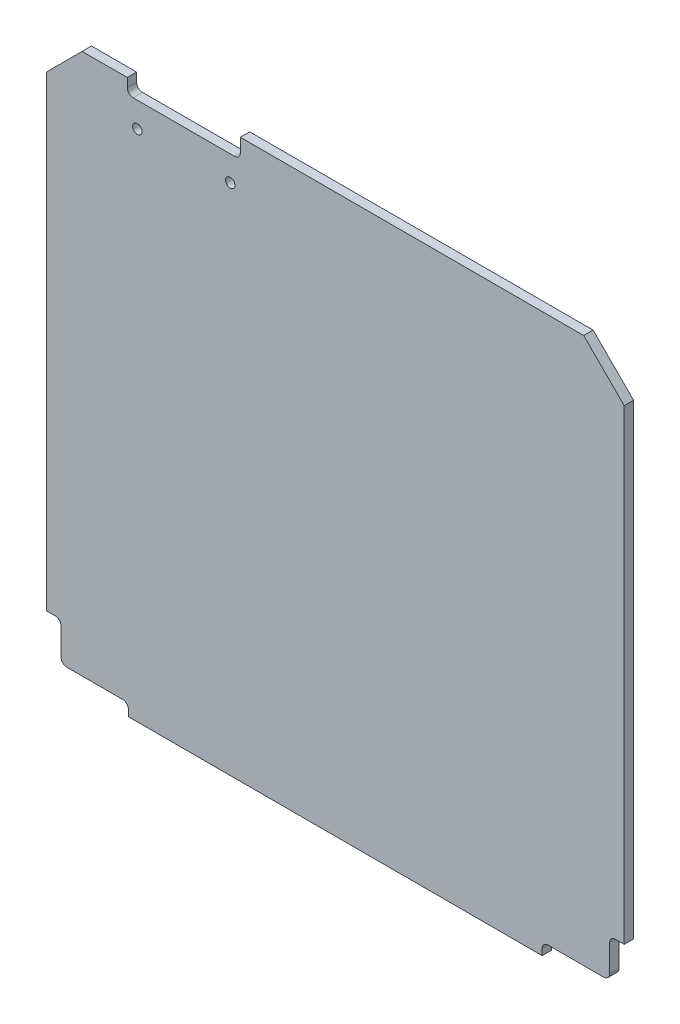
ISO-10303-21;
HEADER;
FILE_DESCRIPTION(('STEP AP214'),'2;1');
FILE_NAME('part.step','',(''),(''),'','','');
FILE_SCHEMA(('AUTOMOTIVE_DESIGN { 1 0 10303 214 1 1 1 1 }'));
ENDSEC;
DATA;
#1=APPLICATION_CONTEXT('core data for automotive mechanical design processes');
#2=APPLICATION_PROTOCOL_DEFINITION('international standard','automotive_design',2000,#1);
#3=PRODUCT_CONTEXT('',#1,'mechanical');
#4=PRODUCT('Part','Part','',(#3));
#5=PRODUCT_RELATED_PRODUCT_CATEGORY('part','',(#4));
#6=PRODUCT_DEFINITION_FORMATION('','',#4);
#7=PRODUCT_DEFINITION_CONTEXT('part definition',#1,'design');
#8=PRODUCT_DEFINITION('design','',#6,#7);
#9=PRODUCT_DEFINITION_SHAPE('','',#8);
#10=(LENGTH_UNIT() NAMED_UNIT(*) SI_UNIT(.MILLI.,.METRE.));
#11=(NAMED_UNIT(*) PLANE_ANGLE_UNIT() SI_UNIT($,.RADIAN.));
#12=(NAMED_UNIT(*) SI_UNIT($,.STERADIAN.) SOLID_ANGLE_UNIT());
#13=UNCERTAINTY_MEASURE_WITH_UNIT(LENGTH_MEASURE(1.E-05),#10,'distance_accuracy_value','');
#14=(GEOMETRIC_REPRESENTATION_CONTEXT(3) GLOBAL_UNCERTAINTY_ASSIGNED_CONTEXT((#13)) GLOBAL_UNIT_ASSIGNED_CONTEXT((#10,
#11,#12)) REPRESENTATION_CONTEXT('',''));
#15=CARTESIAN_POINT('',(0.,0.,0.));
#16=DIRECTION('',(0.,0.,1.));
#17=DIRECTION('',(1.,0.,0.));
#18=AXIS2_PLACEMENT_3D('',#15,#16,#17);
#19=CARTESIAN_POINT('',(0.,0.,1.5875));
#20=DIRECTION('',(0.,0.,1.));
#21=DIRECTION('',(1.,0.,0.));
#22=AXIS2_PLACEMENT_3D('',#19,#20,#21);
#23=PLANE('',#22);
#24=CARTESIAN_POINT('',(-36.3,-48.0000000000001,1.5875));
#25=DIRECTION('',(0.,0.,1.));
#26=DIRECTION('',(1.,0.,0.));
#27=AXIS2_PLACEMENT_3D('',#24,#25,#26);
#28=CIRCLE('',#27,1.);
#29=CARTESIAN_POINT('',(-36.3,-47.0000000000001,1.5875));
#30=VERTEX_POINT('',#29);
#31=CARTESIAN_POINT('',(-35.3,-48.0000000000001,1.5875));
#32=VERTEX_POINT('',#31);
#33=EDGE_CURVE('E344',#30,#32,#28,.F.);
#34=ORIENTED_EDGE('',*,*,#33,.T.);
#35=DIRECTION('',(0.,1.,0.));
#36=VECTOR('',#35,1.);
#37=CARTESIAN_POINT('',(-35.3,0.,1.5875));
#38=LINE('',#37,#36);
#39=CARTESIAN_POINT('',(-35.3,-49.0649999999988,1.5875));
#40=VERTEX_POINT('',#39);
#41=EDGE_CURVE('E227',#32,#40,#38,.F.);
#42=ORIENTED_EDGE('',*,*,#41,.T.);
#43=DIRECTION('',(1.,0.,0.));
#44=VECTOR('',#43,1.);
#45=CARTESIAN_POINT('',(-8.39674998261844,-49.0649999999989,1.5875));
#46=LINE('',#45,#44);
#47=CARTESIAN_POINT('',(35.3,-49.064999999999,1.5875));
#48=VERTEX_POINT('',#47);
#49=EDGE_CURVE('E225',#48,#40,#46,.F.);
#50=ORIENTED_EDGE('',*,*,#49,.F.);
#51=DIRECTION('',(0.,1.,0.));
#52=VECTOR('',#51,1.);
#53=CARTESIAN_POINT('',(35.3,0.,1.5875));
#54=LINE('',#53,#52);
#55=CARTESIAN_POINT('',(35.3,-48.0000000000001,1.5875));
#56=VERTEX_POINT('',#55);
#57=EDGE_CURVE('E185',#48,#56,#54,.T.);
#58=ORIENTED_EDGE('',*,*,#57,.T.);
#59=CARTESIAN_POINT('',(36.3,-48.0000000000001,1.5875));
#60=DIRECTION('',(0.,0.,1.));
#61=DIRECTION('',(0.,-1.,0.));
#62=AXIS2_PLACEMENT_3D('',#59,#60,#61);
#63=CIRCLE('',#62,1.);
#64=CARTESIAN_POINT('',(36.3,-47.0000000000001,1.5875));
#65=VERTEX_POINT('',#64);
#66=EDGE_CURVE('E198',#56,#65,#63,.F.);
#67=ORIENTED_EDGE('',*,*,#66,.T.);
#68=DIRECTION('',(-1.,0.,0.));
#69=VECTOR('',#68,1.);
#70=CARTESIAN_POINT('',(34.9999999999996,-47.0000000000001,1.5875));
#71=LINE('',#70,#69);
#72=CARTESIAN_POINT('',(45.7999999999989,-47.0000000000001,1.5875));
#73=VERTEX_POINT('',#72);
#74=EDGE_CURVE('E190',#65,#73,#71,.F.);
#75=ORIENTED_EDGE('',*,*,#74,.T.);
#76=CARTESIAN_POINT('',(45.7999999999989,-46.0000000000001,1.5875));
#77=DIRECTION('',(0.,0.,1.));
#78=DIRECTION('',(0.,-1.,0.));
#79=AXIS2_PLACEMENT_3D('',#76,#77,#78);
#80=CIRCLE('',#79,1.);
#81=CARTESIAN_POINT('',(46.7999999999989,-46.0000000000001,1.5875));
#82=VERTEX_POINT('',#81);
#83=EDGE_CURVE('E210',#82,#73,#80,.F.);
#84=ORIENTED_EDGE('',*,*,#83,.F.);
#85=DIRECTION('',(0.,1.,0.));
#86=VECTOR('',#85,1.);
#87=CARTESIAN_POINT('',(46.7999999999989,-45.9,1.5875));
#88=LINE('',#87,#86);
#89=CARTESIAN_POINT('',(46.7999999999989,-41.400000000001,1.5875));
#90=VERTEX_POINT('',#89);
#91=EDGE_CURVE('E302',#82,#90,#88,.T.);
#92=ORIENTED_EDGE('',*,*,#91,.T.);
#93=CARTESIAN_POINT('',(47.7999999999989,-41.400000000001,1.5875));
#94=DIRECTION('',(0.,0.,-1.));
#95=DIRECTION('',(0.,1.,0.));
#96=AXIS2_PLACEMENT_3D('',#93,#94,#95);
#97=CIRCLE('',#96,1.);
#98=CARTESIAN_POINT('',(47.7999999999989,-40.400000000001,1.5875));
#99=VERTEX_POINT('',#98);
#100=EDGE_CURVE('E304',#90,#99,#97,.T.);
#101=ORIENTED_EDGE('',*,*,#100,.T.);
#102=DIRECTION('',(1.,0.,0.));
#103=VECTOR('',#102,1.);
#104=CARTESIAN_POINT('',(47.8999999999989,-40.400000000001,1.5875));
#105=LINE('',#104,#103);
#106=CARTESIAN_POINT('',(49.3,-40.400000000001,1.5875));
#107=VERTEX_POINT('',#106);
#108=EDGE_CURVE('E294',#99,#107,#105,.T.);
#109=ORIENTED_EDGE('',*,*,#108,.T.);
#110=DIRECTION('',(0.,1.,0.));
#111=VECTOR('',#110,1.);
#112=CARTESIAN_POINT('',(49.3,50.,1.5875));
#113=LINE('',#112,#111);
#114=CARTESIAN_POINT('',(49.3,39.200000000002,1.5875));
#115=VERTEX_POINT('',#114);
#116=EDGE_CURVE('E292',#115,#107,#113,.F.);
#117=ORIENTED_EDGE('',*,*,#116,.F.);
#118=DIRECTION('',(-0.707106781186546,0.707106781186549,0.));
#119=VECTOR('',#118,1.);
#120=CARTESIAN_POINT('',(40.500000000001,48.0000000000009,1.5875));
#121=LINE('',#120,#119);
#122=CARTESIAN_POINT('',(42.3850000000029,46.1149999999991,1.5875));
#123=VERTEX_POINT('',#122);
#124=EDGE_CURVE('E286',#123,#115,#121,.F.);
#125=ORIENTED_EDGE('',*,*,#124,.F.);
#126=DIRECTION('',(1.,0.,0.));
#127=VECTOR('',#126,1.);
#128=CARTESIAN_POINT('',(8.7249999826205,46.1149999999992,1.5875));
#129=LINE('',#128,#127);
#130=CARTESIAN_POINT('',(-16.2000000086743,46.1149999999993,1.5875));
#131=VERTEX_POINT('',#130);
#132=EDGE_CURVE('E278',#123,#131,#129,.F.);
#133=ORIENTED_EDGE('',*,*,#132,.T.);
#134=DIRECTION('',(0.,-1.,0.));
#135=VECTOR('',#134,1.);
#136=CARTESIAN_POINT('',(-16.2000000086743,43.5490937294837,1.5875));
#137=LINE('',#136,#135);
#138=CARTESIAN_POINT('',(-16.2000000086743,43.8000000000008,1.5875));
#139=VERTEX_POINT('',#138);
#140=EDGE_CURVE('E275',#139,#131,#137,.F.);
#141=ORIENTED_EDGE('',*,*,#140,.F.);
#142=CARTESIAN_POINT('',(-17.2000000086743,43.8000000000008,1.5875));
#143=DIRECTION('',(0.,0.,-1.));
#144=DIRECTION('',(0.,1.,0.));
#145=AXIS2_PLACEMENT_3D('',#142,#143,#144);
#146=CIRCLE('',#145,1.);
#147=CARTESIAN_POINT('',(-17.2000000086743,42.8000000000008,1.58750000000001));
#148=VERTEX_POINT('',#147);
#149=EDGE_CURVE('E274',#139,#148,#146,.T.);
#150=ORIENTED_EDGE('',*,*,#149,.T.);
#151=DIRECTION('',(1.,0.,0.));
#152=VECTOR('',#151,1.);
#153=CARTESIAN_POINT('',(-36.5,42.8000000000009,1.58750000000002));
#154=LINE('',#153,#152);
#155=CARTESIAN_POINT('',(-34.5000000173737,42.8000000000008,1.5875));
#156=VERTEX_POINT('',#155);
#157=EDGE_CURVE('E271',#148,#156,#154,.F.);
#158=ORIENTED_EDGE('',*,*,#157,.T.);
#159=CARTESIAN_POINT('',(-34.5000000173737,43.8000000000008,1.58749999999999));
#160=DIRECTION('',(0.,0.,1.));
#161=DIRECTION('',(0.,-1.,0.));
#162=AXIS2_PLACEMENT_3D('',#159,#160,#161);
#163=CIRCLE('',#162,1.);
#164=CARTESIAN_POINT('',(-35.5000000173737,43.8000000000008,1.5875));
#165=VERTEX_POINT('',#164);
#166=EDGE_CURVE('E268',#156,#165,#163,.F.);
#167=ORIENTED_EDGE('',*,*,#166,.T.);
#168=DIRECTION('',(0.,-1.,0.));
#169=VECTOR('',#168,1.);
#170=CARTESIAN_POINT('',(-35.5000000173737,42.723625569532,1.5875));
#171=LINE('',#170,#169);
#172=CARTESIAN_POINT('',(-35.5000000173737,45.3000000000009,1.58749999999999));
#173=VERTEX_POINT('',#172);
#174=EDGE_CURVE('E265',#165,#173,#171,.F.);
#175=ORIENTED_EDGE('',*,*,#174,.T.);
#176=DIRECTION('',(1.,0.,0.));
#177=VECTOR('',#176,1.);
#178=CARTESIAN_POINT('',(-36.5,45.3000000000009,1.58749999999999));
#179=LINE('',#178,#177);
#180=CARTESIAN_POINT('',(-43.2000000000015,45.3000000000009,1.5875));
#181=VERTEX_POINT('',#180);
#182=EDGE_CURVE('E260',#173,#181,#179,.F.);
#183=ORIENTED_EDGE('',*,*,#182,.T.);
#184=DIRECTION('',(0.707106781186551,0.707106781186544,0.));
#185=VECTOR('',#184,1.);
#186=CARTESIAN_POINT('',(-40.500000000001,48.0000000000013,1.5875));
#187=LINE('',#186,#185);
#188=CARTESIAN_POINT('',(-49.3,39.2000000000024,1.58749999999999));
#189=VERTEX_POINT('',#188);
#190=EDGE_CURVE('E255',#181,#189,#187,.F.);
#191=ORIENTED_EDGE('',*,*,#190,.T.);
#192=DIRECTION('',(0.,1.,0.));
#193=VECTOR('',#192,1.);
#194=CARTESIAN_POINT('',(-49.3000000000007,-214.000093457924,1.58749999999999));
#195=LINE('',#194,#193);
#196=CARTESIAN_POINT('',(-49.3000000000003,-40.400000000001,1.5875));
#197=VERTEX_POINT('',#196);
#198=EDGE_CURVE('E250',#189,#197,#195,.F.);
#199=ORIENTED_EDGE('',*,*,#198,.T.);
#200=DIRECTION('',(1.,0.,0.));
#201=VECTOR('',#200,1.);
#202=CARTESIAN_POINT('',(-51.8999999999992,-40.400000000001,1.5875));
#203=LINE('',#202,#201);
#204=CARTESIAN_POINT('',(-47.7999999999992,-40.400000000001,1.5875));
#205=VERTEX_POINT('',#204);
#206=EDGE_CURVE('E244',#197,#205,#203,.T.);
#207=ORIENTED_EDGE('',*,*,#206,.T.);
#208=CARTESIAN_POINT('',(-47.7999999999992,-41.400000000001,1.5875));
#209=DIRECTION('',(0.,0.,1.));
#210=DIRECTION('',(0.,-1.,0.));
#211=AXIS2_PLACEMENT_3D('',#208,#209,#210);
#212=CIRCLE('',#211,1.);
#213=CARTESIAN_POINT('',(-46.7999999999992,-41.400000000001,1.5875));
#214=VERTEX_POINT('',#213);
#215=EDGE_CURVE('E243',#205,#214,#212,.F.);
#216=ORIENTED_EDGE('',*,*,#215,.T.);
#217=DIRECTION('',(0.,1.,0.));
#218=VECTOR('',#217,1.);
#219=CARTESIAN_POINT('',(-46.7999999999992,-41.400000000001,1.5875));
#220=LINE('',#219,#218);
#221=CARTESIAN_POINT('',(-46.7999999999992,-46.0000000000001,1.5875));
#222=VERTEX_POINT('',#221);
#223=EDGE_CURVE('E239',#214,#222,#220,.F.);
#224=ORIENTED_EDGE('',*,*,#223,.T.);
#225=CARTESIAN_POINT('',(-45.7999999999992,-46.0000000000001,1.5875));
#226=DIRECTION('',(0.,0.,-1.));
#227=DIRECTION('',(-1.,0.,0.));
#228=AXIS2_PLACEMENT_3D('',#225,#226,#227);
#229=CIRCLE('',#228,1.);
#230=CARTESIAN_POINT('',(-45.7999999999992,-47.,1.5875));
#231=VERTEX_POINT('',#230);
#232=EDGE_CURVE('E347',#231,#222,#229,.T.);
#233=ORIENTED_EDGE('',*,*,#232,.F.);
#234=DIRECTION('',(-1.,0.,0.));
#235=VECTOR('',#234,1.);
#236=CARTESIAN_POINT('',(0.,-47.0000000000001,1.5875));
#237=LINE('',#236,#235);
#238=EDGE_CURVE('E235',#231,#30,#237,.F.);
#239=ORIENTED_EDGE('',*,*,#238,.T.);
#240=EDGE_LOOP('',(#34,#42,#50,#58,#67,#75,#84,#92,#101,#109,#117,#125,#133,#141,#150,#158,#167,
#175,#183,#191,#199,#207,#216,#224,#233,#239));
#241=FACE_BOUND('',#240,.T.);
#242=CARTESIAN_POINT('',(-17.9250000173796,38.5406079999998,1.5875));
#243=DIRECTION('',(0.,0.,1.));
#244=DIRECTION('',(1.,0.,0.));
#245=AXIS2_PLACEMENT_3D('',#242,#243,#244);
#246=CIRCLE('',#245,0.8);
#247=CARTESIAN_POINT('',(-17.1250000173796,38.5406079999998,1.5875));
#248=VERTEX_POINT('',#247);
#249=EDGE_CURVE('E222',#248,#248,#246,.F.);
#250=ORIENTED_EDGE('',*,*,#249,.T.);
#251=EDGE_LOOP('',(#250));
#252=FACE_BOUND('',#251,.T.);
#253=CARTESIAN_POINT('',(-33.775,38.5399999996693,1.5875));
#254=DIRECTION('',(0.,0.,1.));
#255=DIRECTION('',(0.,-1.,0.));
#256=AXIS2_PLACEMENT_3D('',#253,#254,#255);
#257=CIRCLE('',#256,0.799999999999997);
#258=CARTESIAN_POINT('',(-33.775,37.7399999996693,1.5875));
#259=VERTEX_POINT('',#258);
#260=EDGE_CURVE('E20',#259,#259,#257,.F.);
#261=ORIENTED_EDGE('',*,*,#260,.T.);
#262=EDGE_LOOP('',(#261));
#263=FACE_BOUND('',#262,.T.);
#264=ADVANCED_FACE('F17',(#241,#252,#263),#23,.T.);
#265=CARTESIAN_POINT('',(-33.775,38.5399999996693,-0.232500000000009));
#266=DIRECTION('',(0.,0.,1.));
#267=DIRECTION('',(0.,-1.,0.));
#268=AXIS2_PLACEMENT_3D('',#265,#266,#267);
#269=CYLINDRICAL_SURFACE('',#268,0.799999999999997);
#270=ORIENTED_EDGE('',*,*,#260,.F.);
#271=EDGE_LOOP('',(#270));
#272=FACE_BOUND('',#271,.T.);
#273=CARTESIAN_POINT('',(-33.775,38.5399999996693,-0.0125000000000028));
#274=DIRECTION('',(0.,0.,1.));
#275=DIRECTION('',(0.,-1.,0.));
#276=AXIS2_PLACEMENT_3D('',#273,#274,#275);
#277=CIRCLE('',#276,0.799999999999997);
#278=CARTESIAN_POINT('',(-33.775,37.7399999996693,-0.0125000000000028));
#279=VERTEX_POINT('',#278);
#280=EDGE_CURVE('E218',#279,#279,#277,.F.);
#281=ORIENTED_EDGE('',*,*,#280,.T.);
#282=EDGE_LOOP('',(#281));
#283=FACE_BOUND('',#282,.T.);
#284=ADVANCED_FACE('F365',(#272,#283),#269,.F.);
#285=CARTESIAN_POINT('',(-17.9250000173796,38.5406079999998,-0.232500000000016));
#286=DIRECTION('',(0.,0.,1.));
#287=DIRECTION('',(1.,0.,0.));
#288=AXIS2_PLACEMENT_3D('',#285,#286,#287);
#289=CYLINDRICAL_SURFACE('',#288,0.8);
#290=ORIENTED_EDGE('',*,*,#249,.F.);
#291=EDGE_LOOP('',(#290));
#292=FACE_BOUND('',#291,.T.);
#293=CARTESIAN_POINT('',(-17.9250000173796,38.5406079999998,-0.0125000000000028));
#294=DIRECTION('',(0.,0.,1.));
#295=DIRECTION('',(1.,0.,0.));
#296=AXIS2_PLACEMENT_3D('',#293,#294,#295);
#297=CIRCLE('',#296,0.8);
#298=CARTESIAN_POINT('',(-17.1250000173796,38.5406079999998,-0.0125000000000028));
#299=VERTEX_POINT('',#298);
#300=EDGE_CURVE('E339',#299,#299,#297,.F.);
#301=ORIENTED_EDGE('',*,*,#300,.T.);
#302=EDGE_LOOP('',(#301));
#303=FACE_BOUND('',#302,.T.);
#304=ADVANCED_FACE('F368',(#292,#303),#289,.F.);
#305=CARTESIAN_POINT('',(35.3,0.,1.5875));
#306=DIRECTION('',(-1.,0.,0.));
#307=DIRECTION('',(0.,0.,1.));
#308=AXIS2_PLACEMENT_3D('',#305,#306,#307);
#309=PLANE('',#308);
#310=DIRECTION('',(0.,0.,1.));
#311=VECTOR('',#310,1.);
#312=CARTESIAN_POINT('',(35.3,-48.0000000000001,0.));
#313=LINE('',#312,#311);
#314=CARTESIAN_POINT('',(35.3,-48.0000000000001,-0.0125000000000028));
#315=VERTEX_POINT('',#314);
#316=EDGE_CURVE('E203',#315,#56,#313,.T.);
#317=ORIENTED_EDGE('',*,*,#316,.T.);
#318=ORIENTED_EDGE('',*,*,#57,.F.);
#319=DIRECTION('',(0.,0.,1.));
#320=VECTOR('',#319,1.);
#321=CARTESIAN_POINT('',(35.3,-49.064999999999,6.49125000000005));
#322=LINE('',#321,#320);
#323=CARTESIAN_POINT('',(35.3,-49.0649999999989,-0.0125000000000029));
#324=VERTEX_POINT('',#323);
#325=EDGE_CURVE('E215',#324,#48,#322,.T.);
#326=ORIENTED_EDGE('',*,*,#325,.F.);
#327=DIRECTION('',(0.,1.,0.));
#328=VECTOR('',#327,1.);
#329=CARTESIAN_POINT('',(35.3,0.,-0.0125000000000028));
#330=LINE('',#329,#328);
#331=EDGE_CURVE('E338',#324,#315,#330,.T.);
#332=ORIENTED_EDGE('',*,*,#331,.T.);
#333=EDGE_LOOP('',(#317,#318,#326,#332));
#334=FACE_BOUND('',#333,.T.);
#335=ADVANCED_FACE('F476',(#334),#309,.F.);
#336=CARTESIAN_POINT('',(36.3,-48.0000000000001,0.));
#337=DIRECTION('',(0.,0.,1.));
#338=DIRECTION('',(0.,-1.,0.));
#339=AXIS2_PLACEMENT_3D('',#336,#337,#338);
#340=CYLINDRICAL_SURFACE('',#339,1.);
#341=ORIENTED_EDGE('',*,*,#66,.F.);
#342=ORIENTED_EDGE('',*,*,#316,.F.);
#343=CARTESIAN_POINT('',(36.3,-48.0000000000001,-0.0125000000000028));
#344=DIRECTION('',(0.,0.,1.));
#345=DIRECTION('',(0.,-1.,0.));
#346=AXIS2_PLACEMENT_3D('',#343,#344,#345);
#347=CIRCLE('',#346,1.);
#348=CARTESIAN_POINT('',(36.3,-47.0000000000001,-0.0125000000000028));
#349=VERTEX_POINT('',#348);
#350=EDGE_CURVE('E208',#315,#349,#347,.F.);
#351=ORIENTED_EDGE('',*,*,#350,.T.);
#352=DIRECTION('',(0.,0.,1.));
#353=VECTOR('',#352,1.);
#354=CARTESIAN_POINT('',(36.3,-47.0000000000001,-0.232500000000009));
#355=LINE('',#354,#353);
#356=EDGE_CURVE('E194',#349,#65,#355,.T.);
#357=ORIENTED_EDGE('',*,*,#356,.T.);
#358=EDGE_LOOP('',(#341,#342,#351,#357));
#359=FACE_BOUND('',#358,.T.);
#360=ADVANCED_FACE('F206',(#359),#340,.F.);
#361=CARTESIAN_POINT('',(34.9999999999996,-47.0000000000001,-0.232500000000009));
#362=DIRECTION('',(0.,1.,0.));
#363=DIRECTION('',(-1.,0.,0.));
#364=AXIS2_PLACEMENT_3D('',#361,#362,#363);
#365=PLANE('',#364);
#366=DIRECTION('',(1.,0.,0.));
#367=VECTOR('',#366,1.);
#368=CARTESIAN_POINT('',(0.,-47.0000000000001,-0.0125000000000028));
#369=LINE('',#368,#367);
#370=CARTESIAN_POINT('',(45.7999999999989,-47.0000000000001,-0.0125000000000028));
#371=VERTEX_POINT('',#370);
#372=EDGE_CURVE('E336',#349,#371,#369,.T.);
#373=ORIENTED_EDGE('',*,*,#372,.T.);
#374=DIRECTION('',(0.,0.,1.));
#375=VECTOR('',#374,1.);
#376=CARTESIAN_POINT('',(45.7999999999989,-47.0000000000001,0.));
#377=LINE('',#376,#375);
#378=EDGE_CURVE('E196',#73,#371,#377,.F.);
#379=ORIENTED_EDGE('',*,*,#378,.F.);
#380=ORIENTED_EDGE('',*,*,#74,.F.);
#381=ORIENTED_EDGE('',*,*,#356,.F.);
#382=EDGE_LOOP('',(#373,#379,#380,#381));
#383=FACE_BOUND('',#382,.T.);
#384=ADVANCED_FACE('F192',(#383),#365,.F.);
#385=CARTESIAN_POINT('',(45.7999999999989,-46.0000000000001,0.));
#386=DIRECTION('',(0.,0.,1.));
#387=DIRECTION('',(0.,-1.,0.));
#388=AXIS2_PLACEMENT_3D('',#385,#386,#387);
#389=CYLINDRICAL_SURFACE('',#388,1.);
#390=DIRECTION('',(0.,0.,1.));
#391=VECTOR('',#390,1.);
#392=CARTESIAN_POINT('',(46.7999999999989,-46.0000000000001,-0.232500000000009));
#393=LINE('',#392,#391);
#394=CARTESIAN_POINT('',(46.7999999999989,-46.0000000000001,-0.0125000000000028));
#395=VERTEX_POINT('',#394);
#396=EDGE_CURVE('E305',#395,#82,#393,.T.);
#397=ORIENTED_EDGE('',*,*,#396,.T.);
#398=ORIENTED_EDGE('',*,*,#83,.T.);
#399=ORIENTED_EDGE('',*,*,#378,.T.);
#400=CARTESIAN_POINT('',(45.7999999999989,-46.0000000000001,-0.0125000000000028));
#401=DIRECTION('',(0.,0.,1.));
#402=DIRECTION('',(0.,-1.,0.));
#403=AXIS2_PLACEMENT_3D('',#400,#401,#402);
#404=CIRCLE('',#403,1.);
#405=EDGE_CURVE('E333',#371,#395,#404,.T.);
#406=ORIENTED_EDGE('',*,*,#405,.T.);
#407=EDGE_LOOP('',(#397,#398,#399,#406));
#408=FACE_BOUND('',#407,.T.);
#409=ADVANCED_FACE('F467',(#408),#389,.T.);
#410=CARTESIAN_POINT('',(46.7999999999989,-45.9,-0.232500000000009));
#411=DIRECTION('',(-1.,0.,0.));
#412=DIRECTION('',(0.,0.,1.));
#413=AXIS2_PLACEMENT_3D('',#410,#411,#412);
#414=PLANE('',#413);
#415=ORIENTED_EDGE('',*,*,#91,.F.);
#416=ORIENTED_EDGE('',*,*,#396,.F.);
#417=DIRECTION('',(0.,1.,0.));
#418=VECTOR('',#417,1.);
#419=CARTESIAN_POINT('',(46.7999999999989,0.,-0.0125000000000028));
#420=LINE('',#419,#418);
#421=CARTESIAN_POINT('',(46.7999999999989,-41.400000000001,-0.0125000000000028));
#422=VERTEX_POINT('',#421);
#423=EDGE_CURVE('E332',#395,#422,#420,.T.);
#424=ORIENTED_EDGE('',*,*,#423,.T.);
#425=DIRECTION('',(0.,0.,-1.));
#426=VECTOR('',#425,1.);
#427=CARTESIAN_POINT('',(46.7999999999989,-41.400000000001,0.));
#428=LINE('',#427,#426);
#429=EDGE_CURVE('E358',#422,#90,#428,.F.);
#430=ORIENTED_EDGE('',*,*,#429,.T.);
#431=EDGE_LOOP('',(#415,#416,#424,#430));
#432=FACE_BOUND('',#431,.T.);
#433=ADVANCED_FACE('F463',(#432),#414,.F.);
#434=CARTESIAN_POINT('',(47.7999999999989,-41.400000000001,0.));
#435=DIRECTION('',(0.,0.,-1.));
#436=DIRECTION('',(0.,1.,0.));
#437=AXIS2_PLACEMENT_3D('',#434,#435,#436);
#438=CYLINDRICAL_SURFACE('',#437,1.);
#439=CARTESIAN_POINT('',(47.7999999999989,-41.400000000001,-0.0125000000000028));
#440=DIRECTION('',(0.,0.,-1.));
#441=DIRECTION('',(0.,1.,0.));
#442=AXIS2_PLACEMENT_3D('',#439,#440,#441);
#443=CIRCLE('',#442,1.);
#444=CARTESIAN_POINT('',(47.7999999999989,-40.400000000001,-0.0125000000000028));
#445=VERTEX_POINT('',#444);
#446=EDGE_CURVE('E328',#422,#445,#443,.T.);
#447=ORIENTED_EDGE('',*,*,#446,.T.);
#448=DIRECTION('',(0.,0.,1.));
#449=VECTOR('',#448,1.);
#450=CARTESIAN_POINT('',(47.7999999999989,-40.400000000001,-0.232500000000009));
#451=LINE('',#450,#449);
#452=EDGE_CURVE('E299',#445,#99,#451,.T.);
#453=ORIENTED_EDGE('',*,*,#452,.T.);
#454=ORIENTED_EDGE('',*,*,#100,.F.);
#455=ORIENTED_EDGE('',*,*,#429,.F.);
#456=EDGE_LOOP('',(#447,#453,#454,#455));
#457=FACE_BOUND('',#456,.T.);
#458=ADVANCED_FACE('F459',(#457),#438,.F.);
#459=CARTESIAN_POINT('',(47.8999999999989,-40.400000000001,-0.232500000000009));
#460=DIRECTION('',(0.,1.,0.));
#461=DIRECTION('',(0.,0.,1.));
#462=AXIS2_PLACEMENT_3D('',#459,#460,#461);
#463=PLANE('',#462);
#464=ORIENTED_EDGE('',*,*,#452,.F.);
#465=DIRECTION('',(1.,0.,0.));
#466=VECTOR('',#465,1.);
#467=CARTESIAN_POINT('',(0.,-40.400000000001,-0.0125000000000028));
#468=LINE('',#467,#466);
#469=CARTESIAN_POINT('',(49.3,-40.400000000001,-0.0125000000000028));
#470=VERTEX_POINT('',#469);
#471=EDGE_CURVE('E331',#445,#470,#468,.T.);
#472=ORIENTED_EDGE('',*,*,#471,.T.);
#473=DIRECTION('',(0.,0.,1.));
#474=VECTOR('',#473,1.);
#475=CARTESIAN_POINT('',(49.3,-40.400000000001,1.5875));
#476=LINE('',#475,#474);
#477=EDGE_CURVE('E289',#107,#470,#476,.F.);
#478=ORIENTED_EDGE('',*,*,#477,.F.);
#479=ORIENTED_EDGE('',*,*,#108,.F.);
#480=EDGE_LOOP('',(#464,#472,#478,#479));
#481=FACE_BOUND('',#480,.T.);
#482=ADVANCED_FACE('F455',(#481),#463,.F.);
#483=CARTESIAN_POINT('',(49.3,50.,1.5875));
#484=DIRECTION('',(1.,0.,0.));
#485=DIRECTION('',(0.,1.,0.));
#486=AXIS2_PLACEMENT_3D('',#483,#484,#485);
#487=PLANE('',#486);
#488=ORIENTED_EDGE('',*,*,#116,.T.);
#489=ORIENTED_EDGE('',*,*,#477,.T.);
#490=DIRECTION('',(0.,1.,0.));
#491=VECTOR('',#490,1.);
#492=CARTESIAN_POINT('',(49.3,0.,-0.0125000000000028));
#493=LINE('',#492,#491);
#494=CARTESIAN_POINT('',(49.3,39.200000000002,-0.0125000000000037));
#495=VERTEX_POINT('',#494);
#496=EDGE_CURVE('E801',#470,#495,#493,.T.);
#497=ORIENTED_EDGE('',*,*,#496,.T.);
#498=DIRECTION('',(0.,0.,1.));
#499=VECTOR('',#498,1.);
#500=CARTESIAN_POINT('',(49.3000000000003,39.2000000000023,-50.0000000000001));
#501=LINE('',#500,#499);
#502=EDGE_CURVE('E288',#115,#495,#501,.F.);
#503=ORIENTED_EDGE('',*,*,#502,.F.);
#504=EDGE_LOOP('',(#488,#489,#497,#503));
#505=FACE_BOUND('',#504,.T.);
#506=ADVANCED_FACE('F451',(#505),#487,.T.);
#507=CARTESIAN_POINT('',(40.5000000000014,48.0000000000013,-50.0000000000001));
#508=DIRECTION('',(0.707106781186549,0.707106781186546,0.));
#509=DIRECTION('',(-0.707106781186546,0.707106781186549,0.));
#510=AXIS2_PLACEMENT_3D('',#507,#508,#509);
#511=PLANE('',#510);
#512=DIRECTION('',(-0.707106781186547,0.707106781186548,0.));
#513=VECTOR('',#512,1.);
#514=CARTESIAN_POINT('',(49.3,39.200000000002,-0.0125000000000028));
#515=LINE('',#514,#513);
#516=CARTESIAN_POINT('',(42.3850000000029,46.1149999999991,-0.0125000000000028));
#517=VERTEX_POINT('',#516);
#518=EDGE_CURVE('E792',#495,#517,#515,.T.);
#519=ORIENTED_EDGE('',*,*,#518,.T.);
#520=DIRECTION('',(0.,0.,1.));
#521=VECTOR('',#520,1.);
#522=CARTESIAN_POINT('',(42.3850000000029,46.1149999999991,1.88750000000154));
#523=LINE('',#522,#521);
#524=EDGE_CURVE('E283',#517,#123,#523,.T.);
#525=ORIENTED_EDGE('',*,*,#524,.T.);
#526=ORIENTED_EDGE('',*,*,#124,.T.);
#527=ORIENTED_EDGE('',*,*,#502,.T.);
#528=EDGE_LOOP('',(#519,#525,#526,#527));
#529=FACE_BOUND('',#528,.T.);
#530=ADVANCED_FACE('F447',(#529),#511,.T.);
#531=CARTESIAN_POINT('',(8.7249999826205,46.1149999999992,1.88750000000154));
#532=DIRECTION('',(0.,-1.,0.));
#533=DIRECTION('',(1.,0.,0.));
#534=AXIS2_PLACEMENT_3D('',#531,#532,#533);
#535=PLANE('',#534);
#536=ORIENTED_EDGE('',*,*,#132,.F.);
#537=ORIENTED_EDGE('',*,*,#524,.F.);
#538=DIRECTION('',(1.,0.,0.));
#539=VECTOR('',#538,1.);
#540=CARTESIAN_POINT('',(0.,46.1149999999991,-0.0125000000000028));
#541=LINE('',#540,#539);
#542=CARTESIAN_POINT('',(-16.2000000086743,46.1149999999992,-0.0125000000000029));
#543=VERTEX_POINT('',#542);
#544=EDGE_CURVE('E789',#517,#543,#541,.F.);
#545=ORIENTED_EDGE('',*,*,#544,.T.);
#546=DIRECTION('',(0.,0.,1.));
#547=VECTOR('',#546,1.);
#548=CARTESIAN_POINT('',(-16.2000000086743,46.1149999999993,2.13250002324215));
#549=LINE('',#548,#547);
#550=EDGE_CURVE('E277',#131,#543,#549,.F.);
#551=ORIENTED_EDGE('',*,*,#550,.F.);
#552=EDGE_LOOP('',(#536,#537,#545,#551));
#553=FACE_BOUND('',#552,.T.);
#554=ADVANCED_FACE('F443',(#553),#535,.F.);
#555=CARTESIAN_POINT('',(-16.2000000086743,43.5490937294837,2.13250002324215));
#556=DIRECTION('',(-1.,0.,0.));
#557=DIRECTION('',(0.,-1.,0.));
#558=AXIS2_PLACEMENT_3D('',#555,#556,#557);
#559=PLANE('',#558);
#560=ORIENTED_EDGE('',*,*,#140,.T.);
#561=ORIENTED_EDGE('',*,*,#550,.T.);
#562=DIRECTION('',(0.,1.,0.));
#563=VECTOR('',#562,1.);
#564=CARTESIAN_POINT('',(-16.2000000086743,0.,-0.0125000000000028));
#565=LINE('',#564,#563);
#566=CARTESIAN_POINT('',(-16.2000000086743,43.8000000000008,-0.0125000000000038));
#567=VERTEX_POINT('',#566);
#568=EDGE_CURVE('E327',#543,#567,#565,.F.);
#569=ORIENTED_EDGE('',*,*,#568,.T.);
#570=DIRECTION('',(0.,0.,-1.));
#571=VECTOR('',#570,1.);
#572=CARTESIAN_POINT('',(-16.2000000086743,43.8000000000008,0.));
#573=LINE('',#572,#571);
#574=EDGE_CURVE('E356',#567,#139,#573,.F.);
#575=ORIENTED_EDGE('',*,*,#574,.T.);
#576=EDGE_LOOP('',(#560,#561,#569,#575));
#577=FACE_BOUND('',#576,.T.);
#578=ADVANCED_FACE('F439',(#577),#559,.T.);
#579=CARTESIAN_POINT('',(-17.2000000086743,43.8000000000008,0.));
#580=DIRECTION('',(0.,0.,-1.));
#581=DIRECTION('',(0.,1.,0.));
#582=AXIS2_PLACEMENT_3D('',#579,#580,#581);
#583=CYLINDRICAL_SURFACE('',#582,1.);
#584=ORIENTED_EDGE('',*,*,#149,.F.);
#585=ORIENTED_EDGE('',*,*,#574,.F.);
#586=CARTESIAN_POINT('',(-17.2000000086743,43.8000000000008,-0.0125000000000028));
#587=DIRECTION('',(0.,0.,-1.));
#588=DIRECTION('',(0.,1.,0.));
#589=AXIS2_PLACEMENT_3D('',#586,#587,#588);
#590=CIRCLE('',#589,1.);
#591=CARTESIAN_POINT('',(-17.2000000086743,42.8000000000008,-0.0125000000000001));
#592=VERTEX_POINT('',#591);
#593=EDGE_CURVE('E324',#567,#592,#590,.T.);
#594=ORIENTED_EDGE('',*,*,#593,.T.);
#595=DIRECTION('',(0.,0.,-1.));
#596=VECTOR('',#595,1.);
#597=CARTESIAN_POINT('',(-17.2000000086743,42.8000000000016,148.987499999999));
#598=LINE('',#597,#596);
#599=EDGE_CURVE('E273',#592,#148,#598,.F.);
#600=ORIENTED_EDGE('',*,*,#599,.T.);
#601=EDGE_LOOP('',(#584,#585,#594,#600));
#602=FACE_BOUND('',#601,.T.);
#603=ADVANCED_FACE('F435',(#602),#583,.F.);
#604=CARTESIAN_POINT('',(-36.5,42.8000000000017,148.987499999999));
#605=DIRECTION('',(0.,-1.,0.));
#606=DIRECTION('',(0.,0.,-1.));
#607=AXIS2_PLACEMENT_3D('',#604,#605,#606);
#608=PLANE('',#607);
#609=DIRECTION('',(1.,0.,0.));
#610=VECTOR('',#609,1.);
#611=CARTESIAN_POINT('',(0.,42.8000000000008,-0.0125000000000028));
#612=LINE('',#611,#610);
#613=CARTESIAN_POINT('',(-34.5000000173737,42.8000000000008,-0.0125));
#614=VERTEX_POINT('',#613);
#615=EDGE_CURVE('E323',#592,#614,#612,.F.);
#616=ORIENTED_EDGE('',*,*,#615,.T.);
#617=DIRECTION('',(0.,0.,1.));
#618=VECTOR('',#617,1.);
#619=CARTESIAN_POINT('',(-34.5000000173737,42.8000000000008,0.));
#620=LINE('',#619,#618);
#621=EDGE_CURVE('E353',#614,#156,#620,.T.);
#622=ORIENTED_EDGE('',*,*,#621,.T.);
#623=ORIENTED_EDGE('',*,*,#157,.F.);
#624=ORIENTED_EDGE('',*,*,#599,.F.);
#625=EDGE_LOOP('',(#616,#622,#623,#624));
#626=FACE_BOUND('',#625,.T.);
#627=ADVANCED_FACE('F431',(#626),#608,.F.);
#628=CARTESIAN_POINT('',(-34.5000000173737,43.8000000000008,0.));
#629=DIRECTION('',(0.,0.,1.));
#630=DIRECTION('',(0.,-1.,0.));
#631=AXIS2_PLACEMENT_3D('',#628,#629,#630);
#632=CYLINDRICAL_SURFACE('',#631,1.);
#633=ORIENTED_EDGE('',*,*,#166,.F.);
#634=ORIENTED_EDGE('',*,*,#621,.F.);
#635=CARTESIAN_POINT('',(-34.5000000173737,43.8000000000008,-0.0125000000000028));
#636=DIRECTION('',(0.,0.,1.));
#637=DIRECTION('',(0.,-1.,0.));
#638=AXIS2_PLACEMENT_3D('',#635,#636,#637);
#639=CIRCLE('',#638,1.);
#640=CARTESIAN_POINT('',(-35.5000000173737,43.8000000000008,-0.0125000000000028));
#641=VERTEX_POINT('',#640);
#642=EDGE_CURVE('E319',#614,#641,#639,.F.);
#643=ORIENTED_EDGE('',*,*,#642,.T.);
#644=DIRECTION('',(0.,0.,1.));
#645=VECTOR('',#644,1.);
#646=CARTESIAN_POINT('',(-35.5000000173737,43.8000000000008,-0.232500000000009));
#647=LINE('',#646,#645);
#648=EDGE_CURVE('E267',#641,#165,#647,.T.);
#649=ORIENTED_EDGE('',*,*,#648,.T.);
#650=EDGE_LOOP('',(#633,#634,#643,#649));
#651=FACE_BOUND('',#650,.T.);
#652=ADVANCED_FACE('F427',(#651),#632,.F.);
#653=CARTESIAN_POINT('',(-35.5000000173737,42.723625569532,-0.232500000000009));
#654=DIRECTION('',(-1.,0.,0.));
#655=DIRECTION('',(0.,-1.,0.));
#656=AXIS2_PLACEMENT_3D('',#653,#654,#655);
#657=PLANE('',#656);
#658=DIRECTION('',(0.,1.,0.));
#659=VECTOR('',#658,1.);
#660=CARTESIAN_POINT('',(-35.5000000173737,0.,-0.0125000000000028));
#661=LINE('',#660,#659);
#662=CARTESIAN_POINT('',(-35.5000000173737,45.3000000000008,-0.0125000000000014));
#663=VERTEX_POINT('',#662);
#664=EDGE_CURVE('E322',#641,#663,#661,.T.);
#665=ORIENTED_EDGE('',*,*,#664,.T.);
#666=DIRECTION('',(0.,0.,-1.));
#667=VECTOR('',#666,1.);
#668=CARTESIAN_POINT('',(-35.5000000173737,45.3000000000017,148.987499999999));
#669=LINE('',#668,#667);
#670=EDGE_CURVE('E262',#663,#173,#669,.F.);
#671=ORIENTED_EDGE('',*,*,#670,.T.);
#672=ORIENTED_EDGE('',*,*,#174,.F.);
#673=ORIENTED_EDGE('',*,*,#648,.F.);
#674=EDGE_LOOP('',(#665,#671,#672,#673));
#675=FACE_BOUND('',#674,.T.);
#676=ADVANCED_FACE('F423',(#675),#657,.F.);
#677=CARTESIAN_POINT('',(-36.5,45.3000000000017,148.987499999999));
#678=DIRECTION('',(0.,-1.,0.));
#679=DIRECTION('',(0.,0.,-1.));
#680=AXIS2_PLACEMENT_3D('',#677,#678,#679);
#681=PLANE('',#680);
#682=ORIENTED_EDGE('',*,*,#182,.F.);
#683=ORIENTED_EDGE('',*,*,#670,.F.);
#684=DIRECTION('',(1.,0.,0.));
#685=VECTOR('',#684,1.);
#686=CARTESIAN_POINT('',(0.,45.3000000000008,-0.0125000000000028));
#687=LINE('',#686,#685);
#688=CARTESIAN_POINT('',(-43.2000000000016,45.3000000000008,-0.0125000000000037));
#689=VERTEX_POINT('',#688);
#690=EDGE_CURVE('E763',#663,#689,#687,.F.);
#691=ORIENTED_EDGE('',*,*,#690,.T.);
#692=DIRECTION('',(0.,0.,1.));
#693=VECTOR('',#692,1.);
#694=CARTESIAN_POINT('',(-43.2000000000017,45.3000000000011,-50.0000000000003));
#695=LINE('',#694,#693);
#696=EDGE_CURVE('E257',#689,#181,#695,.T.);
#697=ORIENTED_EDGE('',*,*,#696,.T.);
#698=EDGE_LOOP('',(#682,#683,#691,#697));
#699=FACE_BOUND('',#698,.T.);
#700=ADVANCED_FACE('F419',(#699),#681,.F.);
#701=CARTESIAN_POINT('',(-40.5000000000012,48.0000000000015,-50.0000000000003));
#702=DIRECTION('',(0.707106781186544,-0.707106781186551,0.));
#703=DIRECTION('',(0.707106781186551,0.707106781186544,0.));
#704=AXIS2_PLACEMENT_3D('',#701,#702,#703);
#705=PLANE('',#704);
#706=ORIENTED_EDGE('',*,*,#696,.F.);
#707=DIRECTION('',(-0.707106781186547,-0.707106781186548,0.));
#708=VECTOR('',#707,1.);
#709=CARTESIAN_POINT('',(-43.2000000000015,45.3000000000009,-0.0125000000000028));
#710=LINE('',#709,#708);
#711=CARTESIAN_POINT('',(-49.3,39.2000000000024,-0.0125000000000014));
#712=VERTEX_POINT('',#711);
#713=EDGE_CURVE('E754',#689,#712,#710,.T.);
#714=ORIENTED_EDGE('',*,*,#713,.T.);
#715=DIRECTION('',(0.,0.,1.));
#716=VECTOR('',#715,1.);
#717=CARTESIAN_POINT('',(-49.3,39.2000000000024,163.999999999999));
#718=LINE('',#717,#716);
#719=EDGE_CURVE('E252',#712,#189,#718,.T.);
#720=ORIENTED_EDGE('',*,*,#719,.T.);
#721=ORIENTED_EDGE('',*,*,#190,.F.);
#722=EDGE_LOOP('',(#706,#714,#720,#721));
#723=FACE_BOUND('',#722,.T.);
#724=ADVANCED_FACE('F415',(#723),#705,.F.);
#725=CARTESIAN_POINT('',(-49.3000000000007,-214.000093457924,163.999999999999));
#726=DIRECTION('',(1.,0.,0.));
#727=DIRECTION('',(0.,1.,0.));
#728=AXIS2_PLACEMENT_3D('',#725,#726,#727);
#729=PLANE('',#728);
#730=ORIENTED_EDGE('',*,*,#198,.F.);
#731=ORIENTED_EDGE('',*,*,#719,.F.);
#732=DIRECTION('',(0.,1.,0.));
#733=VECTOR('',#732,1.);
#734=CARTESIAN_POINT('',(-49.3,0.,-0.0125000000000028));
#735=LINE('',#734,#733);
#736=CARTESIAN_POINT('',(-49.3000000000001,-40.400000000001,-0.0125000000000028));
#737=VERTEX_POINT('',#736);
#738=EDGE_CURVE('E751',#712,#737,#735,.F.);
#739=ORIENTED_EDGE('',*,*,#738,.T.);
#740=DIRECTION('',(0.,0.,1.));
#741=VECTOR('',#740,1.);
#742=CARTESIAN_POINT('',(-49.3000000000003,-40.400000000001,-0.232500000000009));
#743=LINE('',#742,#741);
#744=EDGE_CURVE('E247',#737,#197,#743,.T.);
#745=ORIENTED_EDGE('',*,*,#744,.T.);
#746=EDGE_LOOP('',(#730,#731,#739,#745));
#747=FACE_BOUND('',#746,.T.);
#748=ADVANCED_FACE('F411',(#747),#729,.F.);
#749=CARTESIAN_POINT('',(-51.8999999999992,-40.400000000001,-0.232500000000009));
#750=DIRECTION('',(0.,1.,0.));
#751=DIRECTION('',(0.,0.,1.));
#752=AXIS2_PLACEMENT_3D('',#749,#750,#751);
#753=PLANE('',#752);
#754=ORIENTED_EDGE('',*,*,#744,.F.);
#755=DIRECTION('',(1.,0.,0.));
#756=VECTOR('',#755,1.);
#757=CARTESIAN_POINT('',(0.,-40.400000000001,-0.0125000000000028));
#758=LINE('',#757,#756);
#759=CARTESIAN_POINT('',(-47.7999999999992,-40.400000000001,-0.0125000000000028));
#760=VERTEX_POINT('',#759);
#761=EDGE_CURVE('E318',#737,#760,#758,.T.);
#762=ORIENTED_EDGE('',*,*,#761,.T.);
#763=DIRECTION('',(0.,0.,1.));
#764=VECTOR('',#763,1.);
#765=CARTESIAN_POINT('',(-47.7999999999992,-40.400000000001,0.));
#766=LINE('',#765,#764);
#767=EDGE_CURVE('E246',#760,#205,#766,.T.);
#768=ORIENTED_EDGE('',*,*,#767,.T.);
#769=ORIENTED_EDGE('',*,*,#206,.F.);
#770=EDGE_LOOP('',(#754,#762,#768,#769));
#771=FACE_BOUND('',#770,.T.);
#772=ADVANCED_FACE('F407',(#771),#753,.F.);
#773=CARTESIAN_POINT('',(-47.7999999999992,-41.400000000001,0.));
#774=DIRECTION('',(0.,0.,1.));
#775=DIRECTION('',(0.,-1.,0.));
#776=AXIS2_PLACEMENT_3D('',#773,#774,#775);
#777=CYLINDRICAL_SURFACE('',#776,1.);
#778=ORIENTED_EDGE('',*,*,#215,.F.);
#779=ORIENTED_EDGE('',*,*,#767,.F.);
#780=CARTESIAN_POINT('',(-47.7999999999992,-41.400000000001,-0.0125000000000028));
#781=DIRECTION('',(0.,0.,1.));
#782=DIRECTION('',(0.,-1.,0.));
#783=AXIS2_PLACEMENT_3D('',#780,#781,#782);
#784=CIRCLE('',#783,1.);
#785=CARTESIAN_POINT('',(-46.7999999999992,-41.400000000001,-0.0125000000000028));
#786=VERTEX_POINT('',#785);
#787=EDGE_CURVE('E315',#760,#786,#784,.F.);
#788=ORIENTED_EDGE('',*,*,#787,.T.);
#789=DIRECTION('',(0.,0.,-1.));
#790=VECTOR('',#789,1.);
#791=CARTESIAN_POINT('',(-46.7999999999992,-41.400000000001,-0.232500000000009));
#792=LINE('',#791,#790);
#793=EDGE_CURVE('E242',#786,#214,#792,.F.);
#794=ORIENTED_EDGE('',*,*,#793,.T.);
#795=EDGE_LOOP('',(#778,#779,#788,#794));
#796=FACE_BOUND('',#795,.T.);
#797=ADVANCED_FACE('F403',(#796),#777,.F.);
#798=CARTESIAN_POINT('',(-46.7999999999992,-41.400000000001,-0.232500000000009));
#799=DIRECTION('',(1.,0.,0.));
#800=DIRECTION('',(0.,0.,-1.));
#801=AXIS2_PLACEMENT_3D('',#798,#799,#800);
#802=PLANE('',#801);
#803=DIRECTION('',(0.,1.,0.));
#804=VECTOR('',#803,1.);
#805=CARTESIAN_POINT('',(-46.7999999999992,0.,-0.0125000000000028));
#806=LINE('',#805,#804);
#807=CARTESIAN_POINT('',(-46.7999999999992,-46.0000000000001,-0.0125000000000028));
#808=VERTEX_POINT('',#807);
#809=EDGE_CURVE('E314',#786,#808,#806,.F.);
#810=ORIENTED_EDGE('',*,*,#809,.T.);
#811=DIRECTION('',(0.,0.,-1.));
#812=VECTOR('',#811,1.);
#813=CARTESIAN_POINT('',(-46.7999999999992,-46.0000000000001,0.));
#814=LINE('',#813,#812);
#815=EDGE_CURVE('E238',#222,#808,#814,.T.);
#816=ORIENTED_EDGE('',*,*,#815,.F.);
#817=ORIENTED_EDGE('',*,*,#223,.F.);
#818=ORIENTED_EDGE('',*,*,#793,.F.);
#819=EDGE_LOOP('',(#810,#816,#817,#818));
#820=FACE_BOUND('',#819,.T.);
#821=ADVANCED_FACE('F399',(#820),#802,.F.);
#822=CARTESIAN_POINT('',(-45.7999999999992,-46.0000000000001,0.));
#823=DIRECTION('',(0.,0.,-1.));
#824=DIRECTION('',(-1.,0.,0.));
#825=AXIS2_PLACEMENT_3D('',#822,#823,#824);
#826=CYLINDRICAL_SURFACE('',#825,1.);
#827=ORIENTED_EDGE('',*,*,#815,.T.);
#828=CARTESIAN_POINT('',(-45.7999999999992,-46.0000000000001,-0.0125000000000028));
#829=DIRECTION('',(0.,0.,-1.));
#830=DIRECTION('',(-1.,0.,0.));
#831=AXIS2_PLACEMENT_3D('',#828,#829,#830);
#832=CIRCLE('',#831,1.);
#833=CARTESIAN_POINT('',(-45.7999999999992,-47.0000000000001,-0.0125000000000028));
#834=VERTEX_POINT('',#833);
#835=EDGE_CURVE('E311',#808,#834,#832,.F.);
#836=ORIENTED_EDGE('',*,*,#835,.T.);
#837=DIRECTION('',(0.,0.,1.));
#838=VECTOR('',#837,1.);
#839=CARTESIAN_POINT('',(-45.7999999999992,-47.,1.5875));
#840=LINE('',#839,#838);
#841=EDGE_CURVE('E237',#834,#231,#840,.T.);
#842=ORIENTED_EDGE('',*,*,#841,.T.);
#843=ORIENTED_EDGE('',*,*,#232,.T.);
#844=EDGE_LOOP('',(#827,#836,#842,#843));
#845=FACE_BOUND('',#844,.T.);
#846=ADVANCED_FACE('F395',(#845),#826,.T.);
#847=CARTESIAN_POINT('',(0.,-47.0000000000001,1.5875));
#848=DIRECTION('',(0.,1.,0.));
#849=DIRECTION('',(-1.,0.,0.));
#850=AXIS2_PLACEMENT_3D('',#847,#848,#849);
#851=PLANE('',#850);
#852=DIRECTION('',(1.,0.,0.));
#853=VECTOR('',#852,1.);
#854=CARTESIAN_POINT('',(0.,-47.0000000000001,-0.0125000000000028));
#855=LINE('',#854,#853);
#856=CARTESIAN_POINT('',(-36.3,-47.0000000000001,-0.0125000000000028));
#857=VERTEX_POINT('',#856);
#858=EDGE_CURVE('E310',#834,#857,#855,.T.);
#859=ORIENTED_EDGE('',*,*,#858,.T.);
#860=DIRECTION('',(0.,0.,1.));
#861=VECTOR('',#860,1.);
#862=CARTESIAN_POINT('',(-36.3,-47.0000000000001,1.5875));
#863=LINE('',#862,#861);
#864=EDGE_CURVE('E346',#857,#30,#863,.T.);
#865=ORIENTED_EDGE('',*,*,#864,.T.);
#866=ORIENTED_EDGE('',*,*,#238,.F.);
#867=ORIENTED_EDGE('',*,*,#841,.F.);
#868=EDGE_LOOP('',(#859,#865,#866,#867));
#869=FACE_BOUND('',#868,.T.);
#870=ADVANCED_FACE('F391',(#869),#851,.F.);
#871=CARTESIAN_POINT('',(-36.3,-48.0000000000001,1.5875));
#872=DIRECTION('',(0.,0.,1.));
#873=DIRECTION('',(1.,0.,0.));
#874=AXIS2_PLACEMENT_3D('',#871,#872,#873);
#875=CYLINDRICAL_SURFACE('',#874,1.);
#876=ORIENTED_EDGE('',*,*,#864,.F.);
#877=CARTESIAN_POINT('',(-36.3,-48.0000000000001,-0.0125000000000027));
#878=DIRECTION('',(0.,0.,1.));
#879=DIRECTION('',(1.,0.,0.));
#880=AXIS2_PLACEMENT_3D('',#877,#878,#879);
#881=CIRCLE('',#880,1.);
#882=CARTESIAN_POINT('',(-35.3,-48.0000000000001,-0.0125000000000028));
#883=VERTEX_POINT('',#882);
#884=EDGE_CURVE('E307',#857,#883,#881,.F.);
#885=ORIENTED_EDGE('',*,*,#884,.T.);
#886=DIRECTION('',(0.,0.,-1.));
#887=VECTOR('',#886,1.);
#888=CARTESIAN_POINT('',(-35.3,-48.0000000000001,1.5875));
#889=LINE('',#888,#887);
#890=EDGE_CURVE('E232',#883,#32,#889,.F.);
#891=ORIENTED_EDGE('',*,*,#890,.T.);
#892=ORIENTED_EDGE('',*,*,#33,.F.);
#893=EDGE_LOOP('',(#876,#885,#891,#892));
#894=FACE_BOUND('',#893,.T.);
#895=ADVANCED_FACE('F387',(#894),#875,.F.);
#896=CARTESIAN_POINT('',(-35.3,0.,1.5875));
#897=DIRECTION('',(1.,0.,0.));
#898=DIRECTION('',(0.,0.,-1.));
#899=AXIS2_PLACEMENT_3D('',#896,#897,#898);
#900=PLANE('',#899);
#901=ORIENTED_EDGE('',*,*,#890,.F.);
#902=DIRECTION('',(0.,1.,0.));
#903=VECTOR('',#902,1.);
#904=CARTESIAN_POINT('',(-35.3,0.,-0.0125000000000028));
#905=LINE('',#904,#903);
#906=CARTESIAN_POINT('',(-35.3,-49.0649999999988,-0.0125000000000029));
#907=VERTEX_POINT('',#906);
#908=EDGE_CURVE('E26',#883,#907,#905,.F.);
#909=ORIENTED_EDGE('',*,*,#908,.T.);
#910=DIRECTION('',(0.,0.,1.));
#911=VECTOR('',#910,1.);
#912=CARTESIAN_POINT('',(-35.3,-49.0649999999988,6.49125000000005));
#913=LINE('',#912,#911);
#914=EDGE_CURVE('E34',#40,#907,#913,.F.);
#915=ORIENTED_EDGE('',*,*,#914,.F.);
#916=ORIENTED_EDGE('',*,*,#41,.F.);
#917=EDGE_LOOP('',(#901,#909,#915,#916));
#918=FACE_BOUND('',#917,.T.);
#919=ADVANCED_FACE('F380',(#918),#900,.F.);
#920=CARTESIAN_POINT('',(-8.39674998261844,-49.0649999999989,6.49125000000005));
#921=DIRECTION('',(0.,-1.,0.));
#922=DIRECTION('',(1.,0.,0.));
#923=AXIS2_PLACEMENT_3D('',#920,#921,#922);
#924=PLANE('',#923);
#925=DIRECTION('',(1.,0.,0.));
#926=VECTOR('',#925,1.);
#927=CARTESIAN_POINT('',(0.,-49.0649999999988,-0.0125000000000028));
#928=LINE('',#927,#926);
#929=EDGE_CURVE('E11',#907,#324,#928,.T.);
#930=ORIENTED_EDGE('',*,*,#929,.T.);
#931=ORIENTED_EDGE('',*,*,#325,.T.);
#932=ORIENTED_EDGE('',*,*,#49,.T.);
#933=ORIENTED_EDGE('',*,*,#914,.T.);
#934=EDGE_LOOP('',(#930,#931,#932,#933));
#935=FACE_BOUND('',#934,.T.);
#936=ADVANCED_FACE('F373',(#935),#924,.T.);
#937=CARTESIAN_POINT('',(0.,0.,-0.0125000000000028));
#938=DIRECTION('',(0.,0.,1.));
#939=DIRECTION('',(1.,0.,0.));
#940=AXIS2_PLACEMENT_3D('',#937,#938,#939);
#941=PLANE('',#940);
#942=ORIENTED_EDGE('',*,*,#908,.F.);
#943=ORIENTED_EDGE('',*,*,#884,.F.);
#944=ORIENTED_EDGE('',*,*,#858,.F.);
#945=ORIENTED_EDGE('',*,*,#835,.F.);
#946=ORIENTED_EDGE('',*,*,#809,.F.);
#947=ORIENTED_EDGE('',*,*,#787,.F.);
#948=ORIENTED_EDGE('',*,*,#761,.F.);
#949=ORIENTED_EDGE('',*,*,#738,.F.);
#950=ORIENTED_EDGE('',*,*,#713,.F.);
#951=ORIENTED_EDGE('',*,*,#690,.F.);
#952=ORIENTED_EDGE('',*,*,#664,.F.);
#953=ORIENTED_EDGE('',*,*,#642,.F.);
#954=ORIENTED_EDGE('',*,*,#615,.F.);
#955=ORIENTED_EDGE('',*,*,#593,.F.);
#956=ORIENTED_EDGE('',*,*,#568,.F.);
#957=ORIENTED_EDGE('',*,*,#544,.F.);
#958=ORIENTED_EDGE('',*,*,#518,.F.);
#959=ORIENTED_EDGE('',*,*,#496,.F.);
#960=ORIENTED_EDGE('',*,*,#471,.F.);
#961=ORIENTED_EDGE('',*,*,#446,.F.);
#962=ORIENTED_EDGE('',*,*,#423,.F.);
#963=ORIENTED_EDGE('',*,*,#405,.F.);
#964=ORIENTED_EDGE('',*,*,#372,.F.);
#965=ORIENTED_EDGE('',*,*,#350,.F.);
#966=ORIENTED_EDGE('',*,*,#331,.F.);
#967=ORIENTED_EDGE('',*,*,#929,.F.);
#968=EDGE_LOOP('',(#942,#943,#944,#945,#946,#947,#948,#949,#950,#951,#952,#953,#954,#955,#956,
#957,#958,#959,#960,#961,#962,#963,#964,#965,#966,#967));
#969=FACE_BOUND('',#968,.T.);
#970=ORIENTED_EDGE('',*,*,#300,.F.);
#971=EDGE_LOOP('',(#970));
#972=FACE_BOUND('',#971,.T.);
#973=ORIENTED_EDGE('',*,*,#280,.F.);
#974=EDGE_LOOP('',(#973));
#975=FACE_BOUND('',#974,.T.);
#976=ADVANCED_FACE('F371',(#969,#972,#975),#941,.F.);
#977=CLOSED_SHELL('',(#264,#284,#304,#335,#360,#384,#409,#433,#458,#482,#506,#530,#554,#578,
#603,#627,#652,#676,#700,#724,#748,#772,#797,#821,#846,#870,#895,#919,#936,#976));
#978=MANIFOLD_SOLID_BREP('B1',#977);
#979=ADVANCED_BREP_SHAPE_REPRESENTATION('',(#18,#978),#14);
#980=SHAPE_DEFINITION_REPRESENTATION(#9,#979);
ENDSEC;
END-ISO-10303-21;
